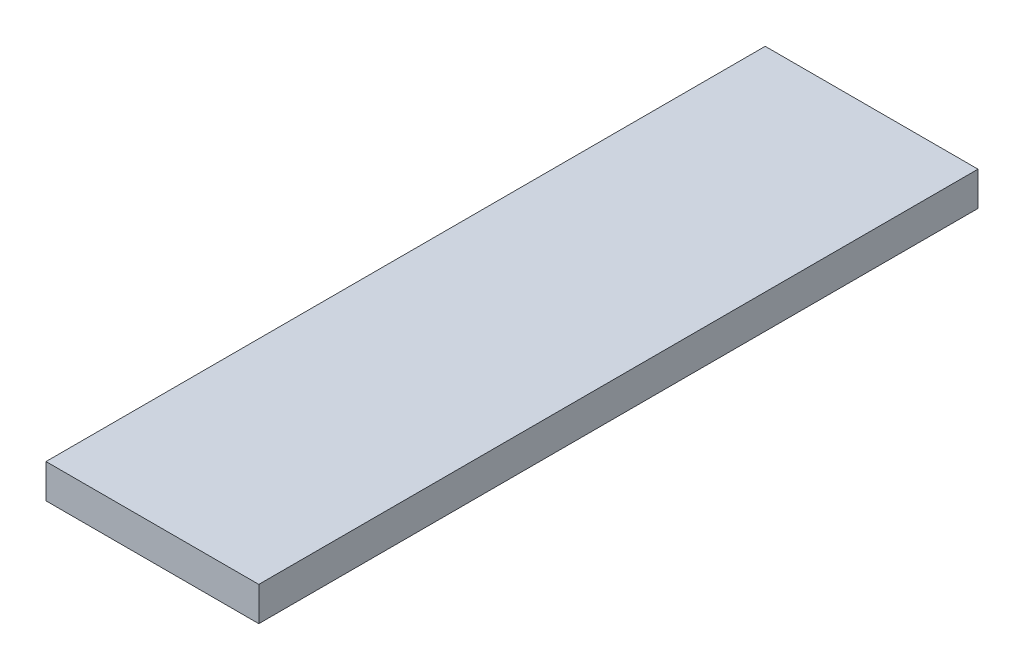
ISO-10303-21;
HEADER;
FILE_DESCRIPTION(('STEP AP214'),'2;1');
FILE_NAME('part.step','',(''),(''),'','','');
FILE_SCHEMA(('AUTOMOTIVE_DESIGN { 1 0 10303 214 1 1 1 1 }'));
ENDSEC;
DATA;
#1=APPLICATION_CONTEXT('core data for automotive mechanical design processes');
#2=APPLICATION_PROTOCOL_DEFINITION('international standard','automotive_design',2000,#1);
#3=PRODUCT_CONTEXT('',#1,'mechanical');
#4=PRODUCT('Part','Part','',(#3));
#5=PRODUCT_RELATED_PRODUCT_CATEGORY('part','',(#4));
#6=PRODUCT_DEFINITION_FORMATION('','',#4);
#7=PRODUCT_DEFINITION_CONTEXT('part definition',#1,'design');
#8=PRODUCT_DEFINITION('design','',#6,#7);
#9=PRODUCT_DEFINITION_SHAPE('','',#8);
#10=(LENGTH_UNIT() NAMED_UNIT(*) SI_UNIT(.MILLI.,.METRE.));
#11=(NAMED_UNIT(*) PLANE_ANGLE_UNIT() SI_UNIT($,.RADIAN.));
#12=(NAMED_UNIT(*) SI_UNIT($,.STERADIAN.) SOLID_ANGLE_UNIT());
#13=UNCERTAINTY_MEASURE_WITH_UNIT(LENGTH_MEASURE(1.E-05),#10,'distance_accuracy_value','');
#14=(GEOMETRIC_REPRESENTATION_CONTEXT(3) GLOBAL_UNCERTAINTY_ASSIGNED_CONTEXT((#13)) GLOBAL_UNIT_ASSIGNED_CONTEXT((#10,
#11,#12)) REPRESENTATION_CONTEXT('',''));
#15=CARTESIAN_POINT('',(0.,0.,0.));
#16=DIRECTION('',(0.,0.,1.));
#17=DIRECTION('',(1.,0.,0.));
#18=AXIS2_PLACEMENT_3D('',#15,#16,#17);
#19=CARTESIAN_POINT('',(0.,0.,878.543822418755));
#20=DIRECTION('',(-1.,0.,0.));
#21=DIRECTION('',(0.,0.,1.));
#22=AXIS2_PLACEMENT_3D('',#19,#20,#21);
#23=PLANE('',#22);
#24=DIRECTION('',(0.,1.,0.));
#25=VECTOR('',#24,1.);
#26=CARTESIAN_POINT('',(0.,0.,676.));
#27=LINE('',#26,#25);
#28=CARTESIAN_POINT('',(0.,0.,676.));
#29=VERTEX_POINT('',#28);
#30=CARTESIAN_POINT('',(0.,32.,676.));
#31=VERTEX_POINT('',#30);
#32=EDGE_CURVE('E91',#29,#31,#27,.T.);
#33=ORIENTED_EDGE('',*,*,#32,.F.);
#34=DIRECTION('',(0.,0.,-1.));
#35=VECTOR('',#34,1.);
#36=CARTESIAN_POINT('',(0.,0.,878.543822418755));
#37=LINE('',#36,#35);
#38=CARTESIAN_POINT('',(0.,0.,0.));
#39=VERTEX_POINT('',#38);
#40=EDGE_CURVE('E44',#29,#39,#37,.T.);
#41=ORIENTED_EDGE('',*,*,#40,.T.);
#42=DIRECTION('',(0.,1.,0.));
#43=VECTOR('',#42,1.);
#44=CARTESIAN_POINT('',(0.,0.,0.));
#45=LINE('',#44,#43);
#46=CARTESIAN_POINT('',(0.,32.,0.));
#47=VERTEX_POINT('',#46);
#48=EDGE_CURVE('E89',#39,#47,#45,.T.);
#49=ORIENTED_EDGE('',*,*,#48,.T.);
#50=DIRECTION('',(0.,0.,-1.));
#51=VECTOR('',#50,1.);
#52=CARTESIAN_POINT('',(0.,32.,878.543822418755));
#53=LINE('',#52,#51);
#54=EDGE_CURVE('E80',#31,#47,#53,.T.);
#55=ORIENTED_EDGE('',*,*,#54,.F.);
#56=EDGE_LOOP('',(#33,#41,#49,#55));
#57=FACE_BOUND('',#56,.T.);
#58=ADVANCED_FACE('F40',(#57),#23,.F.);
#59=CARTESIAN_POINT('',(0.,32.,878.543822418755));
#60=DIRECTION('',(0.,-1.,0.));
#61=DIRECTION('',(1.,0.,0.));
#62=AXIS2_PLACEMENT_3D('',#59,#60,#61);
#63=PLANE('',#62);
#64=DIRECTION('',(-1.,0.,0.));
#65=VECTOR('',#64,1.);
#66=CARTESIAN_POINT('',(0.,32.,676.));
#67=LINE('',#66,#65);
#68=CARTESIAN_POINT('',(-200.,32.,676.));
#69=VERTEX_POINT('',#68);
#70=EDGE_CURVE('E50',#31,#69,#67,.T.);
#71=ORIENTED_EDGE('',*,*,#70,.F.);
#72=ORIENTED_EDGE('',*,*,#54,.T.);
#73=DIRECTION('',(-1.,0.,0.));
#74=VECTOR('',#73,1.);
#75=CARTESIAN_POINT('',(0.,32.,0.));
#76=LINE('',#75,#74);
#77=CARTESIAN_POINT('',(-200.,32.,0.));
#78=VERTEX_POINT('',#77);
#79=EDGE_CURVE('E103',#47,#78,#76,.T.);
#80=ORIENTED_EDGE('',*,*,#79,.T.);
#81=DIRECTION('',(0.,0.,-1.));
#82=VECTOR('',#81,1.);
#83=CARTESIAN_POINT('',(-200.,32.,878.543822418755));
#84=LINE('',#83,#82);
#85=EDGE_CURVE('E118',#69,#78,#84,.T.);
#86=ORIENTED_EDGE('',*,*,#85,.F.);
#87=EDGE_LOOP('',(#71,#72,#80,#86));
#88=FACE_BOUND('',#87,.T.);
#89=ADVANCED_FACE('F127',(#88),#63,.F.);
#90=CARTESIAN_POINT('',(-200.,0.,878.543822418755));
#91=DIRECTION('',(1.,0.,0.));
#92=DIRECTION('',(0.,0.,-1.));
#93=AXIS2_PLACEMENT_3D('',#90,#91,#92);
#94=PLANE('',#93);
#95=DIRECTION('',(0.,-1.,0.));
#96=VECTOR('',#95,1.);
#97=CARTESIAN_POINT('',(-200.,-1.00875006344662E-13,676.));
#98=LINE('',#97,#96);
#99=CARTESIAN_POINT('',(-200.,0.,676.));
#100=VERTEX_POINT('',#99);
#101=EDGE_CURVE('E11',#69,#100,#98,.T.);
#102=ORIENTED_EDGE('',*,*,#101,.F.);
#103=ORIENTED_EDGE('',*,*,#85,.T.);
#104=DIRECTION('',(0.,-1.,0.));
#105=VECTOR('',#104,1.);
#106=CARTESIAN_POINT('',(-200.,0.,0.));
#107=LINE('',#106,#105);
#108=CARTESIAN_POINT('',(-200.,0.,0.));
#109=VERTEX_POINT('',#108);
#110=EDGE_CURVE('E120',#78,#109,#107,.T.);
#111=ORIENTED_EDGE('',*,*,#110,.T.);
#112=DIRECTION('',(0.,0.,-1.));
#113=VECTOR('',#112,1.);
#114=CARTESIAN_POINT('',(-200.,0.,878.543822418755));
#115=LINE('',#114,#113);
#116=EDGE_CURVE('E63',#100,#109,#115,.T.);
#117=ORIENTED_EDGE('',*,*,#116,.F.);
#118=EDGE_LOOP('',(#102,#103,#111,#117));
#119=FACE_BOUND('',#118,.T.);
#120=ADVANCED_FACE('F126',(#119),#94,.F.);
#121=CARTESIAN_POINT('',(0.,0.,878.543822418755));
#122=DIRECTION('',(0.,1.,0.));
#123=DIRECTION('',(-1.,0.,0.));
#124=AXIS2_PLACEMENT_3D('',#121,#122,#123);
#125=PLANE('',#124);
#126=DIRECTION('',(1.,0.,0.));
#127=VECTOR('',#126,1.);
#128=CARTESIAN_POINT('',(0.,0.,676.));
#129=LINE('',#128,#127);
#130=EDGE_CURVE('E100',#100,#29,#129,.T.);
#131=ORIENTED_EDGE('',*,*,#130,.F.);
#132=ORIENTED_EDGE('',*,*,#116,.T.);
#133=DIRECTION('',(1.,0.,0.));
#134=VECTOR('',#133,1.);
#135=CARTESIAN_POINT('',(0.,0.,0.));
#136=LINE('',#135,#134);
#137=EDGE_CURVE('E95',#109,#39,#136,.T.);
#138=ORIENTED_EDGE('',*,*,#137,.T.);
#139=ORIENTED_EDGE('',*,*,#40,.F.);
#140=EDGE_LOOP('',(#131,#132,#138,#139));
#141=FACE_BOUND('',#140,.T.);
#142=ADVANCED_FACE('F96',(#141),#125,.F.);
#143=CARTESIAN_POINT('',(0.,0.,0.));
#144=DIRECTION('',(0.,0.,1.));
#145=DIRECTION('',(1.,0.,0.));
#146=AXIS2_PLACEMENT_3D('',#143,#144,#145);
#147=PLANE('',#146);
#148=ORIENTED_EDGE('',*,*,#48,.F.);
#149=ORIENTED_EDGE('',*,*,#137,.F.);
#150=ORIENTED_EDGE('',*,*,#110,.F.);
#151=ORIENTED_EDGE('',*,*,#79,.F.);
#152=EDGE_LOOP('',(#148,#149,#150,#151));
#153=FACE_BOUND('',#152,.T.);
#154=ADVANCED_FACE('F102',(#153),#147,.F.);
#155=CARTESIAN_POINT('',(4.00000000000005,24.7000000000022,676.));
#156=DIRECTION('',(0.,0.,1.));
#157=DIRECTION('',(0.,1.,0.));
#158=AXIS2_PLACEMENT_3D('',#155,#156,#157);
#159=PLANE('',#158);
#160=ORIENTED_EDGE('',*,*,#130,.T.);
#161=ORIENTED_EDGE('',*,*,#32,.T.);
#162=ORIENTED_EDGE('',*,*,#70,.T.);
#163=ORIENTED_EDGE('',*,*,#101,.T.);
#164=EDGE_LOOP('',(#160,#161,#162,#163));
#165=FACE_BOUND('',#164,.T.);
#166=ADVANCED_FACE('F42',(#165),#159,.T.);
#167=CLOSED_SHELL('',(#58,#89,#120,#142,#154,#166));
#168=MANIFOLD_SOLID_BREP('B2',#167);
#169=ADVANCED_BREP_SHAPE_REPRESENTATION('',(#18,#168),#14);
#170=SHAPE_DEFINITION_REPRESENTATION(#9,#169);
ENDSEC;
END-ISO-10303-21;
